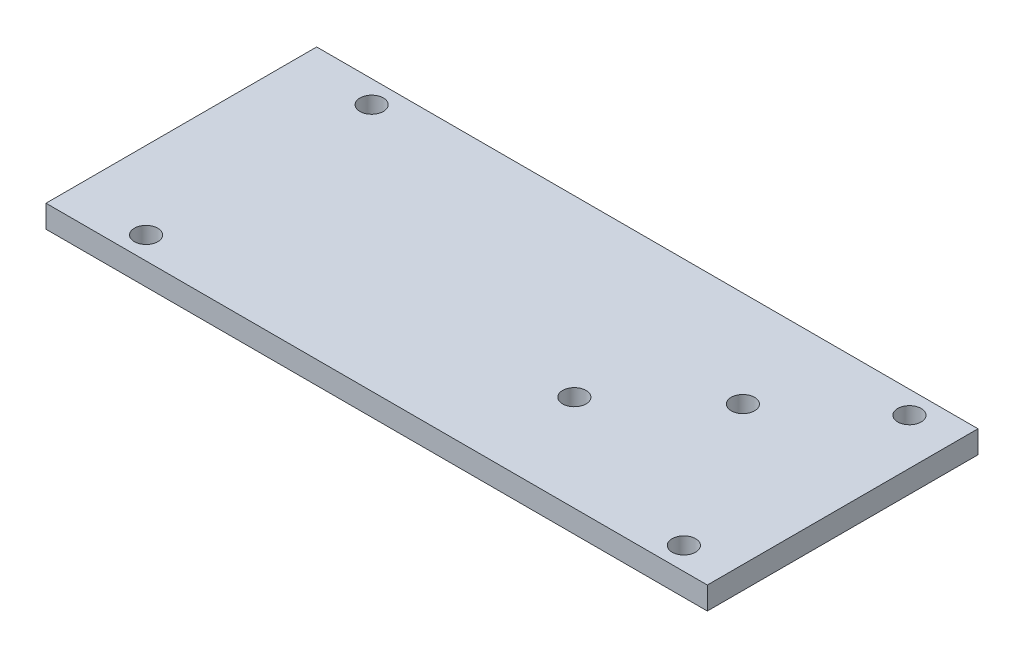
ISO-10303-21;
HEADER;
FILE_DESCRIPTION(('STEP AP214'),'2;1');
FILE_NAME('part.step','',(''),(''),'','','');
FILE_SCHEMA(('AUTOMOTIVE_DESIGN { 1 0 10303 214 1 1 1 1 }'));
ENDSEC;
DATA;
#1=APPLICATION_CONTEXT('core data for automotive mechanical design processes');
#2=APPLICATION_PROTOCOL_DEFINITION('international standard','automotive_design',2000,#1);
#3=PRODUCT_CONTEXT('',#1,'mechanical');
#4=PRODUCT('Part','Part','',(#3));
#5=PRODUCT_RELATED_PRODUCT_CATEGORY('part','',(#4));
#6=PRODUCT_DEFINITION_FORMATION('','',#4);
#7=PRODUCT_DEFINITION_CONTEXT('part definition',#1,'design');
#8=PRODUCT_DEFINITION('design','',#6,#7);
#9=PRODUCT_DEFINITION_SHAPE('','',#8);
#10=(LENGTH_UNIT() NAMED_UNIT(*) SI_UNIT(.MILLI.,.METRE.));
#11=(NAMED_UNIT(*) PLANE_ANGLE_UNIT() SI_UNIT($,.RADIAN.));
#12=(NAMED_UNIT(*) SI_UNIT($,.STERADIAN.) SOLID_ANGLE_UNIT());
#13=UNCERTAINTY_MEASURE_WITH_UNIT(LENGTH_MEASURE(1.E-05),#10,'distance_accuracy_value','');
#14=(GEOMETRIC_REPRESENTATION_CONTEXT(3) GLOBAL_UNCERTAINTY_ASSIGNED_CONTEXT((#13)) GLOBAL_UNIT_ASSIGNED_CONTEXT((#10,
#11,#12)) REPRESENTATION_CONTEXT('',''));
#15=CARTESIAN_POINT('',(0.,0.,0.));
#16=DIRECTION('',(0.,0.,1.));
#17=DIRECTION('',(1.,0.,0.));
#18=AXIS2_PLACEMENT_3D('',#15,#16,#17);
#19=CARTESIAN_POINT('',(0.,3.175,0.));
#20=DIRECTION('',(0.,-1.,0.));
#21=DIRECTION('',(0.,0.,-1.));
#22=AXIS2_PLACEMENT_3D('',#19,#20,#21);
#23=PLANE('',#22);
#24=CARTESIAN_POINT('',(26.9875,3.175,-5.5118));
#25=DIRECTION('',(0.,1.,0.));
#26=DIRECTION('',(0.,0.,1.));
#27=AXIS2_PLACEMENT_3D('',#24,#25,#26);
#28=CIRCLE('',#27,1.65099999999997);
#29=CARTESIAN_POINT('',(26.9875,3.175,-3.86080000000003));
#30=VERTEX_POINT('',#29);
#31=EDGE_CURVE('E133',#30,#30,#28,.T.);
#32=ORIENTED_EDGE('',*,*,#31,.F.);
#33=EDGE_LOOP('',(#32));
#34=FACE_BOUND('',#33,.T.);
#35=CARTESIAN_POINT('',(-35.6311927405971,3.175,15.875));
#36=DIRECTION('',(0.,1.,0.));
#37=DIRECTION('',(0.,0.,1.));
#38=AXIS2_PLACEMENT_3D('',#35,#36,#37);
#39=CIRCLE('',#38,1.65099999999997);
#40=CARTESIAN_POINT('',(-35.6311927405971,3.175,17.526));
#41=VERTEX_POINT('',#40);
#42=EDGE_CURVE('E121',#41,#41,#39,.T.);
#43=ORIENTED_EDGE('',*,*,#42,.F.);
#44=EDGE_LOOP('',(#43));
#45=FACE_BOUND('',#44,.T.);
#46=CARTESIAN_POINT('',(40.0685,3.175,-15.875));
#47=DIRECTION('',(0.,1.,0.));
#48=DIRECTION('',(0.,0.,1.));
#49=AXIS2_PLACEMENT_3D('',#46,#47,#48);
#50=CIRCLE('',#49,1.65099999999997);
#51=CARTESIAN_POINT('',(40.0685,3.175,-14.224));
#52=VERTEX_POINT('',#51);
#53=EDGE_CURVE('E100',#52,#52,#50,.T.);
#54=ORIENTED_EDGE('',*,*,#53,.F.);
#55=EDGE_LOOP('',(#54));
#56=FACE_BOUND('',#55,.T.);
#57=DIRECTION('',(0.,0.,-1.));
#58=VECTOR('',#57,1.);
#59=CARTESIAN_POINT('',(46.5455,3.175,19.05));
#60=LINE('',#59,#58);
#61=CARTESIAN_POINT('',(46.5455,3.175,19.05));
#62=VERTEX_POINT('',#61);
#63=CARTESIAN_POINT('',(46.5455,3.175,-19.05));
#64=VERTEX_POINT('',#63);
#65=EDGE_CURVE('E85',#62,#64,#60,.T.);
#66=ORIENTED_EDGE('',*,*,#65,.T.);
#67=DIRECTION('',(-1.,0.,0.));
#68=VECTOR('',#67,1.);
#69=CARTESIAN_POINT('',(-46.5455,3.175,-19.05));
#70=LINE('',#69,#68);
#71=CARTESIAN_POINT('',(-46.5455,3.175,-19.05));
#72=VERTEX_POINT('',#71);
#73=EDGE_CURVE('E80',#64,#72,#70,.T.);
#74=ORIENTED_EDGE('',*,*,#73,.T.);
#75=DIRECTION('',(0.,0.,1.));
#76=VECTOR('',#75,1.);
#77=CARTESIAN_POINT('',(-46.5455,3.175,19.05));
#78=LINE('',#77,#76);
#79=CARTESIAN_POINT('',(-46.5455,3.175,19.05));
#80=VERTEX_POINT('',#79);
#81=EDGE_CURVE('E83',#72,#80,#78,.T.);
#82=ORIENTED_EDGE('',*,*,#81,.T.);
#83=DIRECTION('',(1.,0.,0.));
#84=VECTOR('',#83,1.);
#85=CARTESIAN_POINT('',(-46.5455,3.175,19.05));
#86=LINE('',#85,#84);
#87=EDGE_CURVE('E50',#80,#62,#86,.T.);
#88=ORIENTED_EDGE('',*,*,#87,.T.);
#89=EDGE_LOOP('',(#66,#74,#82,#88));
#90=FACE_BOUND('',#89,.T.);
#91=CARTESIAN_POINT('',(40.0685,3.175,15.875));
#92=DIRECTION('',(0.,1.,0.));
#93=DIRECTION('',(0.,0.,1.));
#94=AXIS2_PLACEMENT_3D('',#91,#92,#93);
#95=CIRCLE('',#94,1.65099999999997);
#96=CARTESIAN_POINT('',(40.0685,3.175,17.526));
#97=VERTEX_POINT('',#96);
#98=EDGE_CURVE('E115',#97,#97,#95,.T.);
#99=ORIENTED_EDGE('',*,*,#98,.F.);
#100=EDGE_LOOP('',(#99));
#101=FACE_BOUND('',#100,.T.);
#102=CARTESIAN_POINT('',(-35.6311927405971,3.175,-15.875));
#103=DIRECTION('',(0.,1.,0.));
#104=DIRECTION('',(0.,0.,1.));
#105=AXIS2_PLACEMENT_3D('',#102,#103,#104);
#106=CIRCLE('',#105,1.65099999999997);
#107=CARTESIAN_POINT('',(-35.6311927405971,3.175,-14.224));
#108=VERTEX_POINT('',#107);
#109=EDGE_CURVE('E127',#108,#108,#106,.T.);
#110=ORIENTED_EDGE('',*,*,#109,.F.);
#111=EDGE_LOOP('',(#110));
#112=FACE_BOUND('',#111,.T.);
#113=CARTESIAN_POINT('',(14.2875,3.175,5.5118));
#114=DIRECTION('',(0.,1.,0.));
#115=DIRECTION('',(0.,0.,1.));
#116=AXIS2_PLACEMENT_3D('',#113,#114,#115);
#117=CIRCLE('',#116,1.65099999999997);
#118=CARTESIAN_POINT('',(14.2875,3.175,7.16279999999997));
#119=VERTEX_POINT('',#118);
#120=EDGE_CURVE('E139',#119,#119,#117,.T.);
#121=ORIENTED_EDGE('',*,*,#120,.F.);
#122=EDGE_LOOP('',(#121));
#123=FACE_BOUND('',#122,.T.);
#124=ADVANCED_FACE('F33',(#34,#45,#56,#90,#101,#112,#123),#23,.F.);
#125=CARTESIAN_POINT('',(0.,0.,0.));
#126=DIRECTION('',(0.,-1.,0.));
#127=DIRECTION('',(0.,0.,-1.));
#128=AXIS2_PLACEMENT_3D('',#125,#126,#127);
#129=PLANE('',#128);
#130=CARTESIAN_POINT('',(26.9875,0.,-5.5118));
#131=DIRECTION('',(0.,1.,0.));
#132=DIRECTION('',(0.,0.,1.));
#133=AXIS2_PLACEMENT_3D('',#130,#131,#132);
#134=CIRCLE('',#133,1.65099999999997);
#135=CARTESIAN_POINT('',(26.9875,0.,-3.86080000000003));
#136=VERTEX_POINT('',#135);
#137=EDGE_CURVE('E136',#136,#136,#134,.T.);
#138=ORIENTED_EDGE('',*,*,#137,.T.);
#139=EDGE_LOOP('',(#138));
#140=FACE_BOUND('',#139,.T.);
#141=CARTESIAN_POINT('',(-35.6311927405971,0.,15.875));
#142=DIRECTION('',(0.,1.,0.));
#143=DIRECTION('',(0.,0.,1.));
#144=AXIS2_PLACEMENT_3D('',#141,#142,#143);
#145=CIRCLE('',#144,1.65099999999997);
#146=CARTESIAN_POINT('',(-35.6311927405971,0.,17.526));
#147=VERTEX_POINT('',#146);
#148=EDGE_CURVE('E124',#147,#147,#145,.T.);
#149=ORIENTED_EDGE('',*,*,#148,.T.);
#150=EDGE_LOOP('',(#149));
#151=FACE_BOUND('',#150,.T.);
#152=CARTESIAN_POINT('',(40.0685,0.,-15.875));
#153=DIRECTION('',(0.,1.,0.));
#154=DIRECTION('',(0.,0.,1.));
#155=AXIS2_PLACEMENT_3D('',#152,#153,#154);
#156=CIRCLE('',#155,1.65099999999997);
#157=CARTESIAN_POINT('',(40.0685,0.,-14.224));
#158=VERTEX_POINT('',#157);
#159=EDGE_CURVE('E112',#158,#158,#156,.T.);
#160=ORIENTED_EDGE('',*,*,#159,.T.);
#161=EDGE_LOOP('',(#160));
#162=FACE_BOUND('',#161,.T.);
#163=DIRECTION('',(0.,0.,-1.));
#164=VECTOR('',#163,1.);
#165=CARTESIAN_POINT('',(46.5455,0.,19.05));
#166=LINE('',#165,#164);
#167=CARTESIAN_POINT('',(46.5455,0.,19.05));
#168=VERTEX_POINT('',#167);
#169=CARTESIAN_POINT('',(46.5455,0.,-19.05));
#170=VERTEX_POINT('',#169);
#171=EDGE_CURVE('E97',#168,#170,#166,.T.);
#172=ORIENTED_EDGE('',*,*,#171,.F.);
#173=DIRECTION('',(1.,0.,0.));
#174=VECTOR('',#173,1.);
#175=CARTESIAN_POINT('',(-46.5455,0.,19.05));
#176=LINE('',#175,#174);
#177=CARTESIAN_POINT('',(-46.5455,0.,19.05));
#178=VERTEX_POINT('',#177);
#179=EDGE_CURVE('E73',#178,#168,#176,.T.);
#180=ORIENTED_EDGE('',*,*,#179,.F.);
#181=DIRECTION('',(0.,0.,1.));
#182=VECTOR('',#181,1.);
#183=CARTESIAN_POINT('',(-46.5455,0.,19.05));
#184=LINE('',#183,#182);
#185=CARTESIAN_POINT('',(-46.5455,0.,-19.05));
#186=VERTEX_POINT('',#185);
#187=EDGE_CURVE('E67',#186,#178,#184,.T.);
#188=ORIENTED_EDGE('',*,*,#187,.F.);
#189=DIRECTION('',(-1.,0.,0.));
#190=VECTOR('',#189,1.);
#191=CARTESIAN_POINT('',(-46.5455,0.,-19.05));
#192=LINE('',#191,#190);
#193=EDGE_CURVE('E89',#170,#186,#192,.T.);
#194=ORIENTED_EDGE('',*,*,#193,.F.);
#195=EDGE_LOOP('',(#172,#180,#188,#194));
#196=FACE_BOUND('',#195,.T.);
#197=CARTESIAN_POINT('',(40.0685,0.,15.875));
#198=DIRECTION('',(0.,1.,0.));
#199=DIRECTION('',(0.,0.,1.));
#200=AXIS2_PLACEMENT_3D('',#197,#198,#199);
#201=CIRCLE('',#200,1.65099999999997);
#202=CARTESIAN_POINT('',(40.0685,0.,17.526));
#203=VERTEX_POINT('',#202);
#204=EDGE_CURVE('E118',#203,#203,#201,.T.);
#205=ORIENTED_EDGE('',*,*,#204,.T.);
#206=EDGE_LOOP('',(#205));
#207=FACE_BOUND('',#206,.T.);
#208=CARTESIAN_POINT('',(-35.6311927405971,0.,-15.875));
#209=DIRECTION('',(0.,1.,0.));
#210=DIRECTION('',(0.,0.,1.));
#211=AXIS2_PLACEMENT_3D('',#208,#209,#210);
#212=CIRCLE('',#211,1.65099999999997);
#213=CARTESIAN_POINT('',(-35.6311927405971,0.,-14.224));
#214=VERTEX_POINT('',#213);
#215=EDGE_CURVE('E130',#214,#214,#212,.T.);
#216=ORIENTED_EDGE('',*,*,#215,.T.);
#217=EDGE_LOOP('',(#216));
#218=FACE_BOUND('',#217,.T.);
#219=CARTESIAN_POINT('',(14.2875,0.,5.5118));
#220=DIRECTION('',(0.,1.,0.));
#221=DIRECTION('',(0.,0.,1.));
#222=AXIS2_PLACEMENT_3D('',#219,#220,#221);
#223=CIRCLE('',#222,1.65099999999997);
#224=CARTESIAN_POINT('',(14.2875,0.,7.16279999999997));
#225=VERTEX_POINT('',#224);
#226=EDGE_CURVE('E142',#225,#225,#223,.T.);
#227=ORIENTED_EDGE('',*,*,#226,.T.);
#228=EDGE_LOOP('',(#227));
#229=FACE_BOUND('',#228,.T.);
#230=ADVANCED_FACE('F108',(#140,#151,#162,#196,#207,#218,#229),#129,.T.);
#231=CARTESIAN_POINT('',(46.5455,3.175,19.05));
#232=DIRECTION('',(-1.,0.,0.));
#233=DIRECTION('',(0.,0.,1.));
#234=AXIS2_PLACEMENT_3D('',#231,#232,#233);
#235=PLANE('',#234);
#236=ORIENTED_EDGE('',*,*,#171,.T.);
#237=DIRECTION('',(0.,-1.,0.));
#238=VECTOR('',#237,1.);
#239=CARTESIAN_POINT('',(46.5455,3.175,-19.05));
#240=LINE('',#239,#238);
#241=EDGE_CURVE('E11',#64,#170,#240,.T.);
#242=ORIENTED_EDGE('',*,*,#241,.F.);
#243=ORIENTED_EDGE('',*,*,#65,.F.);
#244=DIRECTION('',(0.,-1.,0.));
#245=VECTOR('',#244,1.);
#246=CARTESIAN_POINT('',(46.5455,3.175,19.05));
#247=LINE('',#246,#245);
#248=EDGE_CURVE('E93',#62,#168,#247,.T.);
#249=ORIENTED_EDGE('',*,*,#248,.T.);
#250=EDGE_LOOP('',(#236,#242,#243,#249));
#251=FACE_BOUND('',#250,.T.);
#252=ADVANCED_FACE('F35',(#251),#235,.F.);
#253=CARTESIAN_POINT('',(-46.5455,3.175,-19.05));
#254=DIRECTION('',(0.,0.,1.));
#255=DIRECTION('',(1.,0.,0.));
#256=AXIS2_PLACEMENT_3D('',#253,#254,#255);
#257=PLANE('',#256);
#258=ORIENTED_EDGE('',*,*,#193,.T.);
#259=DIRECTION('',(0.,-1.,0.));
#260=VECTOR('',#259,1.);
#261=CARTESIAN_POINT('',(-46.5455,3.175,-19.05));
#262=LINE('',#261,#260);
#263=EDGE_CURVE('E42',#72,#186,#262,.T.);
#264=ORIENTED_EDGE('',*,*,#263,.F.);
#265=ORIENTED_EDGE('',*,*,#73,.F.);
#266=ORIENTED_EDGE('',*,*,#241,.T.);
#267=EDGE_LOOP('',(#258,#264,#265,#266));
#268=FACE_BOUND('',#267,.T.);
#269=ADVANCED_FACE('F88',(#268),#257,.F.);
#270=CARTESIAN_POINT('',(-46.5455,3.175,19.05));
#271=DIRECTION('',(1.,0.,0.));
#272=DIRECTION('',(0.,0.,-1.));
#273=AXIS2_PLACEMENT_3D('',#270,#271,#272);
#274=PLANE('',#273);
#275=ORIENTED_EDGE('',*,*,#187,.T.);
#276=DIRECTION('',(0.,-1.,0.));
#277=VECTOR('',#276,1.);
#278=CARTESIAN_POINT('',(-46.5455,3.175,19.05));
#279=LINE('',#278,#277);
#280=EDGE_CURVE('E90',#80,#178,#279,.T.);
#281=ORIENTED_EDGE('',*,*,#280,.F.);
#282=ORIENTED_EDGE('',*,*,#81,.F.);
#283=ORIENTED_EDGE('',*,*,#263,.T.);
#284=EDGE_LOOP('',(#275,#281,#282,#283));
#285=FACE_BOUND('',#284,.T.);
#286=ADVANCED_FACE('F91',(#285),#274,.F.);
#287=CARTESIAN_POINT('',(-46.5455,3.175,19.05));
#288=DIRECTION('',(0.,0.,-1.));
#289=DIRECTION('',(-1.,0.,0.));
#290=AXIS2_PLACEMENT_3D('',#287,#288,#289);
#291=PLANE('',#290);
#292=ORIENTED_EDGE('',*,*,#179,.T.);
#293=ORIENTED_EDGE('',*,*,#248,.F.);
#294=ORIENTED_EDGE('',*,*,#87,.F.);
#295=ORIENTED_EDGE('',*,*,#280,.T.);
#296=EDGE_LOOP('',(#292,#293,#294,#295));
#297=FACE_BOUND('',#296,.T.);
#298=ADVANCED_FACE('F105',(#297),#291,.F.);
#299=CARTESIAN_POINT('',(40.0685,3.175,-15.875));
#300=DIRECTION('',(0.,-1.,0.));
#301=DIRECTION('',(0.,0.,-1.));
#302=AXIS2_PLACEMENT_3D('',#299,#300,#301);
#303=CYLINDRICAL_SURFACE('',#302,1.65099999999997);
#304=ORIENTED_EDGE('',*,*,#53,.T.);
#305=EDGE_LOOP('',(#304));
#306=FACE_BOUND('',#305,.T.);
#307=ORIENTED_EDGE('',*,*,#159,.F.);
#308=EDGE_LOOP('',(#307));
#309=FACE_BOUND('',#308,.T.);
#310=ADVANCED_FACE('F162',(#306,#309),#303,.F.);
#311=CARTESIAN_POINT('',(40.0685,3.175,15.875));
#312=DIRECTION('',(0.,-1.,0.));
#313=DIRECTION('',(0.,0.,-1.));
#314=AXIS2_PLACEMENT_3D('',#311,#312,#313);
#315=CYLINDRICAL_SURFACE('',#314,1.65099999999997);
#316=ORIENTED_EDGE('',*,*,#98,.T.);
#317=EDGE_LOOP('',(#316));
#318=FACE_BOUND('',#317,.T.);
#319=ORIENTED_EDGE('',*,*,#204,.F.);
#320=EDGE_LOOP('',(#319));
#321=FACE_BOUND('',#320,.T.);
#322=ADVANCED_FACE('F208',(#318,#321),#315,.F.);
#323=CARTESIAN_POINT('',(-35.6311927405971,3.175,15.875));
#324=DIRECTION('',(0.,-1.,0.));
#325=DIRECTION('',(0.,0.,-1.));
#326=AXIS2_PLACEMENT_3D('',#323,#324,#325);
#327=CYLINDRICAL_SURFACE('',#326,1.65099999999997);
#328=ORIENTED_EDGE('',*,*,#42,.T.);
#329=EDGE_LOOP('',(#328));
#330=FACE_BOUND('',#329,.T.);
#331=ORIENTED_EDGE('',*,*,#148,.F.);
#332=EDGE_LOOP('',(#331));
#333=FACE_BOUND('',#332,.T.);
#334=ADVANCED_FACE('F216',(#330,#333),#327,.F.);
#335=CARTESIAN_POINT('',(-35.6311927405971,3.175,-15.875));
#336=DIRECTION('',(0.,-1.,0.));
#337=DIRECTION('',(0.,0.,-1.));
#338=AXIS2_PLACEMENT_3D('',#335,#336,#337);
#339=CYLINDRICAL_SURFACE('',#338,1.65099999999997);
#340=ORIENTED_EDGE('',*,*,#109,.T.);
#341=EDGE_LOOP('',(#340));
#342=FACE_BOUND('',#341,.T.);
#343=ORIENTED_EDGE('',*,*,#215,.F.);
#344=EDGE_LOOP('',(#343));
#345=FACE_BOUND('',#344,.T.);
#346=ADVANCED_FACE('F224',(#342,#345),#339,.F.);
#347=CARTESIAN_POINT('',(26.9875,3.175,-5.5118));
#348=DIRECTION('',(0.,-1.,0.));
#349=DIRECTION('',(0.,0.,-1.));
#350=AXIS2_PLACEMENT_3D('',#347,#348,#349);
#351=CYLINDRICAL_SURFACE('',#350,1.65099999999997);
#352=ORIENTED_EDGE('',*,*,#31,.T.);
#353=EDGE_LOOP('',(#352));
#354=FACE_BOUND('',#353,.T.);
#355=ORIENTED_EDGE('',*,*,#137,.F.);
#356=EDGE_LOOP('',(#355));
#357=FACE_BOUND('',#356,.T.);
#358=ADVANCED_FACE('F233',(#354,#357),#351,.F.);
#359=CARTESIAN_POINT('',(14.2875,3.175,5.5118));
#360=DIRECTION('',(0.,-1.,0.));
#361=DIRECTION('',(0.,0.,-1.));
#362=AXIS2_PLACEMENT_3D('',#359,#360,#361);
#363=CYLINDRICAL_SURFACE('',#362,1.65099999999997);
#364=ORIENTED_EDGE('',*,*,#120,.T.);
#365=EDGE_LOOP('',(#364));
#366=FACE_BOUND('',#365,.T.);
#367=ORIENTED_EDGE('',*,*,#226,.F.);
#368=EDGE_LOOP('',(#367));
#369=FACE_BOUND('',#368,.T.);
#370=ADVANCED_FACE('F148',(#366,#369),#363,.F.);
#371=CLOSED_SHELL('',(#124,#230,#252,#269,#286,#298,#310,#322,#334,#346,#358,#370));
#372=MANIFOLD_SOLID_BREP('B2',#371);
#373=ADVANCED_BREP_SHAPE_REPRESENTATION('',(#18,#372),#14);
#374=SHAPE_DEFINITION_REPRESENTATION(#9,#373);
ENDSEC;
END-ISO-10303-21;
